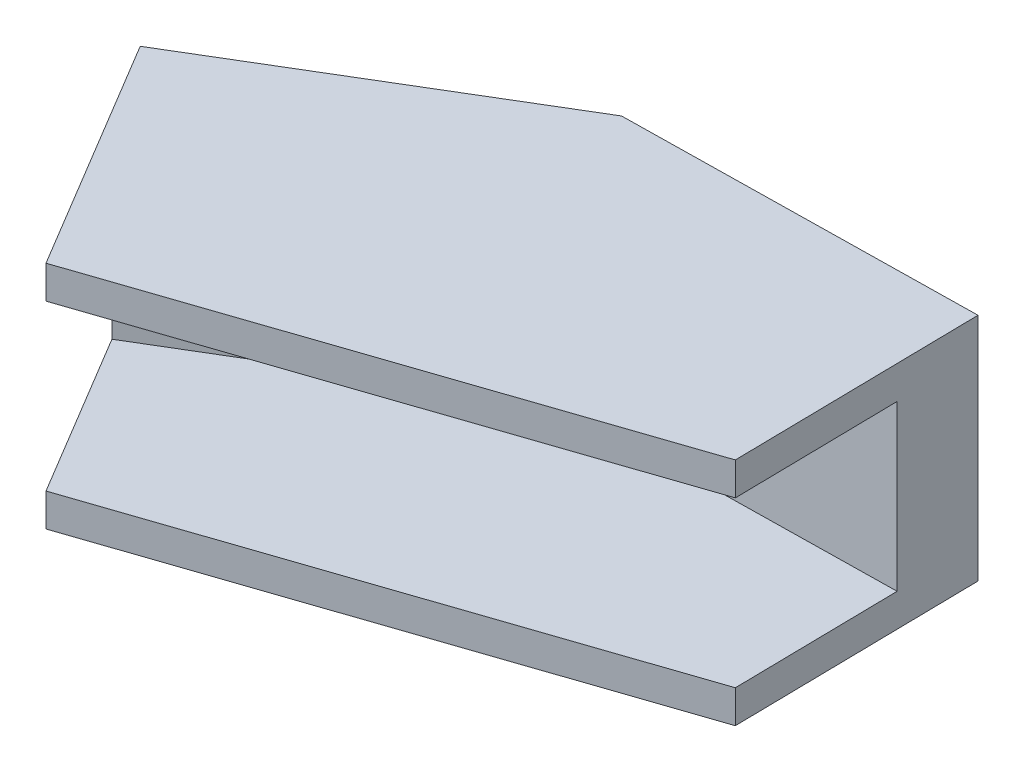
ISO-10303-21;
HEADER;
FILE_DESCRIPTION(('STEP AP214'),'2;1');
FILE_NAME('part.step','',(''),(''),'','','');
FILE_SCHEMA(('AUTOMOTIVE_DESIGN { 1 0 10303 214 1 1 1 1 }'));
ENDSEC;
DATA;
#1=APPLICATION_CONTEXT('core data for automotive mechanical design processes');
#2=APPLICATION_PROTOCOL_DEFINITION('international standard','automotive_design',2000,#1);
#3=PRODUCT_CONTEXT('',#1,'mechanical');
#4=PRODUCT('Part','Part','',(#3));
#5=PRODUCT_RELATED_PRODUCT_CATEGORY('part','',(#4));
#6=PRODUCT_DEFINITION_FORMATION('','',#4);
#7=PRODUCT_DEFINITION_CONTEXT('part definition',#1,'design');
#8=PRODUCT_DEFINITION('design','',#6,#7);
#9=PRODUCT_DEFINITION_SHAPE('','',#8);
#10=(LENGTH_UNIT() NAMED_UNIT(*) SI_UNIT(.MILLI.,.METRE.));
#11=(NAMED_UNIT(*) PLANE_ANGLE_UNIT() SI_UNIT($,.RADIAN.));
#12=(NAMED_UNIT(*) SI_UNIT($,.STERADIAN.) SOLID_ANGLE_UNIT());
#13=UNCERTAINTY_MEASURE_WITH_UNIT(LENGTH_MEASURE(1.E-05),#10,'distance_accuracy_value','');
#14=(GEOMETRIC_REPRESENTATION_CONTEXT(3) GLOBAL_UNCERTAINTY_ASSIGNED_CONTEXT((#13)) GLOBAL_UNIT_ASSIGNED_CONTEXT((#10,
#11,#12)) REPRESENTATION_CONTEXT('',''));
#15=CARTESIAN_POINT('',(0.,0.,0.));
#16=DIRECTION('',(0.,0.,1.));
#17=DIRECTION('',(1.,0.,0.));
#18=AXIS2_PLACEMENT_3D('',#15,#16,#17);
#19=CARTESIAN_POINT('',(19.9973993317551,10.,-0.32252126491264));
#20=DIRECTION('',(0.999869966587755,0.,-0.016126063245632));
#21=DIRECTION('',(-0.016126063245632,0.,-0.999869966587755));
#22=AXIS2_PLACEMENT_3D('',#19,#20,#21);
#23=PLANE('',#22);
#24=DIRECTION('',(0.,-1.,0.));
#25=VECTOR('',#24,1.);
#26=CARTESIAN_POINT('',(19.9973993317551,10.,-0.322521264912666));
#27=LINE('',#26,#25);
#28=CARTESIAN_POINT('',(19.9973993317551,10.,-0.322521264912667));
#29=VERTEX_POINT('',#28);
#30=CARTESIAN_POINT('',(19.9973993317551,0.,-0.322521264912666));
#31=VERTEX_POINT('',#30);
#32=EDGE_CURVE('E63',#29,#31,#27,.T.);
#33=ORIENTED_EDGE('',*,*,#32,.T.);
#34=DIRECTION('',(-0.0161260632456342,0.,-0.999869966587755));
#35=VECTOR('',#34,1.);
#36=CARTESIAN_POINT('',(19.9973993317551,0.,-0.322521264912666));
#37=LINE('',#36,#35);
#38=CARTESIAN_POINT('',(20.1586809362088,0.,9.67747873508733));
#39=VERTEX_POINT('',#38);
#40=EDGE_CURVE('E142',#39,#31,#37,.T.);
#41=ORIENTED_EDGE('',*,*,#40,.F.);
#42=DIRECTION('',(0.,1.,0.));
#43=VECTOR('',#42,1.);
#44=CARTESIAN_POINT('',(20.1586809362088,-2.,9.67747873508733));
#45=LINE('',#44,#43);
#46=CARTESIAN_POINT('',(20.1586809362088,-2.,9.67747873508733));
#47=VERTEX_POINT('',#46);
#48=EDGE_CURVE('E151',#47,#39,#45,.T.);
#49=ORIENTED_EDGE('',*,*,#48,.F.);
#50=DIRECTION('',(-0.016126063245632,0.,-0.999869966587755));
#51=VECTOR('',#50,1.);
#52=CARTESIAN_POINT('',(19.9167690155269,-2.,-5.32187109785144));
#53=LINE('',#52,#51);
#54=CARTESIAN_POINT('',(19.9167690155269,-2.,-5.32187109785144));
#55=VERTEX_POINT('',#54);
#56=EDGE_CURVE('E133',#47,#55,#53,.T.);
#57=ORIENTED_EDGE('',*,*,#56,.T.);
#58=DIRECTION('',(0.,-1.,0.));
#59=VECTOR('',#58,1.);
#60=CARTESIAN_POINT('',(19.9167690155269,10.,-5.32187109785144));
#61=LINE('',#60,#59);
#62=CARTESIAN_POINT('',(19.9167690155269,12.,-5.32187109785144));
#63=VERTEX_POINT('',#62);
#64=EDGE_CURVE('E11',#63,#55,#61,.T.);
#65=ORIENTED_EDGE('',*,*,#64,.F.);
#66=DIRECTION('',(-0.0161260632456342,0.,-0.999869966587755));
#67=VECTOR('',#66,1.);
#68=CARTESIAN_POINT('',(19.9973993317551,12.,-0.322521264912666));
#69=LINE('',#68,#67);
#70=CARTESIAN_POINT('',(20.1586809362088,12.,9.67747873508733));
#71=VERTEX_POINT('',#70);
#72=EDGE_CURVE('E160',#71,#63,#69,.T.);
#73=ORIENTED_EDGE('',*,*,#72,.F.);
#74=DIRECTION('',(0.,-1.,0.));
#75=VECTOR('',#74,1.);
#76=CARTESIAN_POINT('',(20.1586809362088,12.,9.67747873508733));
#77=LINE('',#76,#75);
#78=CARTESIAN_POINT('',(20.1586809362088,10.,9.67747873508733));
#79=VERTEX_POINT('',#78);
#80=EDGE_CURVE('E165',#71,#79,#77,.T.);
#81=ORIENTED_EDGE('',*,*,#80,.T.);
#82=DIRECTION('',(-0.016126063245632,0.,-0.999869966587755));
#83=VECTOR('',#82,1.);
#84=CARTESIAN_POINT('',(19.9167690155269,10.,-5.32187109785144));
#85=LINE('',#84,#83);
#86=EDGE_CURVE('E156',#79,#29,#85,.T.);
#87=ORIENTED_EDGE('',*,*,#86,.T.);
#88=EDGE_LOOP('',(#33,#41,#49,#57,#65,#73,#81,#87));
#89=FACE_BOUND('',#88,.T.);
#90=ADVANCED_FACE('F35',(#89),#23,.T.);
#91=CARTESIAN_POINT('',(-0.0806303162281668,10.,-4.99934983293877));
#92=DIRECTION('',(-0.0161260632456334,0.,-0.999869966587755));
#93=DIRECTION('',(-0.999869966587755,0.,0.0161260632456334));
#94=AXIS2_PLACEMENT_3D('',#91,#92,#93);
#95=PLANE('',#94);
#96=ORIENTED_EDGE('',*,*,#64,.T.);
#97=DIRECTION('',(-0.999869966587755,0.,0.0161260632456334));
#98=VECTOR('',#97,1.);
#99=CARTESIAN_POINT('',(-1.42020206664477,-2.,-4.97774500481997));
#100=LINE('',#99,#98);
#101=CARTESIAN_POINT('',(-1.42020206664477,-2.,-4.97774500481997));
#102=VERTEX_POINT('',#101);
#103=EDGE_CURVE('E125',#55,#102,#100,.T.);
#104=ORIENTED_EDGE('',*,*,#103,.T.);
#105=DIRECTION('',(0.,-1.,0.));
#106=VECTOR('',#105,1.);
#107=CARTESIAN_POINT('',(-1.42020206664477,10.,-4.97774500481997));
#108=LINE('',#107,#106);
#109=CARTESIAN_POINT('',(-1.42020206664477,12.,-4.97774500481997));
#110=VERTEX_POINT('',#109);
#111=EDGE_CURVE('E43',#110,#102,#108,.T.);
#112=ORIENTED_EDGE('',*,*,#111,.F.);
#113=DIRECTION('',(-0.999869966587755,0.,0.0161260632456334));
#114=VECTOR('',#113,1.);
#115=CARTESIAN_POINT('',(-1.42020206664477,12.,-4.97774500481997));
#116=LINE('',#115,#114);
#117=EDGE_CURVE('E163',#63,#110,#116,.T.);
#118=ORIENTED_EDGE('',*,*,#117,.F.);
#119=EDGE_LOOP('',(#96,#104,#112,#118));
#120=FACE_BOUND('',#119,.T.);
#121=ADVANCED_FACE('F132',(#120),#95,.T.);
#122=CARTESIAN_POINT('',(-2.56950281863813,10.,-4.2892487996164));
#123=DIRECTION('',(0.513900563727625,0.,0.85784975992328));
#124=DIRECTION('',(0.85784975992328,0.,-0.513900563727625));
#125=AXIS2_PLACEMENT_3D('',#122,#123,#124);
#126=PLANE('',#125);
#127=ORIENTED_EDGE('',*,*,#111,.T.);
#128=DIRECTION('',(-0.85784975992328,0.,0.513900563727625));
#129=VECTOR('',#128,1.);
#130=CARTESIAN_POINT('',(-19.7264980171037,-2.,5.98876247493611));
#131=LINE('',#130,#129);
#132=CARTESIAN_POINT('',(-19.7264980171037,-2.,5.98876247493611));
#133=VERTEX_POINT('',#132);
#134=EDGE_CURVE('E113',#102,#133,#131,.T.);
#135=ORIENTED_EDGE('',*,*,#134,.T.);
#136=DIRECTION('',(0.,-1.,0.));
#137=VECTOR('',#136,1.);
#138=CARTESIAN_POINT('',(-19.7264980171037,10.,5.98876247493611));
#139=LINE('',#138,#137);
#140=CARTESIAN_POINT('',(-19.7264980171037,12.,5.98876247493611));
#141=VERTEX_POINT('',#140);
#142=EDGE_CURVE('E120',#141,#133,#139,.T.);
#143=ORIENTED_EDGE('',*,*,#142,.F.);
#144=DIRECTION('',(-0.85784975992328,0.,0.513900563727625));
#145=VECTOR('',#144,1.);
#146=CARTESIAN_POINT('',(-19.7264980171037,12.,5.98876247493611));
#147=LINE('',#146,#145);
#148=EDGE_CURVE('E115',#110,#141,#147,.T.);
#149=ORIENTED_EDGE('',*,*,#148,.F.);
#150=EDGE_LOOP('',(#127,#135,#143,#149));
#151=FACE_BOUND('',#150,.T.);
#152=ADVANCED_FACE('F112',(#151),#126,.F.);
#153=CARTESIAN_POINT('',(-17.1569951984656,10.,10.2780112745525));
#154=DIRECTION('',(0.85784975992328,0.,-0.513900563727625));
#155=DIRECTION('',(-0.513900563727625,0.,-0.85784975992328));
#156=AXIS2_PLACEMENT_3D('',#153,#154,#155);
#157=PLANE('',#156);
#158=DIRECTION('',(0.,-1.,0.));
#159=VECTOR('',#158,1.);
#160=CARTESIAN_POINT('',(-17.1569951984656,10.,10.2780112745525));
#161=LINE('',#160,#159);
#162=CARTESIAN_POINT('',(-17.1569951984656,10.,10.2780112745525));
#163=VERTEX_POINT('',#162);
#164=CARTESIAN_POINT('',(-17.1569951984656,0.,10.2780112745525));
#165=VERTEX_POINT('',#164);
#166=EDGE_CURVE('E188',#163,#165,#161,.T.);
#167=ORIENTED_EDGE('',*,*,#166,.F.);
#168=DIRECTION('',(0.513900563727625,0.,0.85784975992328));
#169=VECTOR('',#168,1.);
#170=CARTESIAN_POINT('',(-17.1569951984656,10.,10.2780112745525));
#171=LINE('',#170,#169);
#172=CARTESIAN_POINT('',(-11.1664291607298,10.,20.2780112745525));
#173=VERTEX_POINT('',#172);
#174=EDGE_CURVE('E153',#163,#173,#171,.T.);
#175=ORIENTED_EDGE('',*,*,#174,.T.);
#176=DIRECTION('',(0.,-1.,0.));
#177=VECTOR('',#176,1.);
#178=CARTESIAN_POINT('',(-11.1664291607298,12.,20.2780112745525));
#179=LINE('',#178,#177);
#180=CARTESIAN_POINT('',(-11.1664291607298,12.,20.2780112745525));
#181=VERTEX_POINT('',#180);
#182=EDGE_CURVE('E174',#181,#173,#179,.T.);
#183=ORIENTED_EDGE('',*,*,#182,.F.);
#184=DIRECTION('',(0.513900563727625,0.,0.85784975992328));
#185=VECTOR('',#184,1.);
#186=CARTESIAN_POINT('',(-19.7264980171037,12.,5.98876247493611));
#187=LINE('',#186,#185);
#188=EDGE_CURVE('E155',#141,#181,#187,.T.);
#189=ORIENTED_EDGE('',*,*,#188,.F.);
#190=ORIENTED_EDGE('',*,*,#142,.T.);
#191=DIRECTION('',(0.513900563727625,0.,0.85784975992328));
#192=VECTOR('',#191,1.);
#193=CARTESIAN_POINT('',(-17.1569951984656,-2.,10.2780112745525));
#194=LINE('',#193,#192);
#195=CARTESIAN_POINT('',(-11.1664291607298,-2.,20.2780112745525));
#196=VERTEX_POINT('',#195);
#197=EDGE_CURVE('E129',#133,#196,#194,.T.);
#198=ORIENTED_EDGE('',*,*,#197,.T.);
#199=DIRECTION('',(0.,1.,0.));
#200=VECTOR('',#199,1.);
#201=CARTESIAN_POINT('',(-11.1664291607298,-2.,20.2780112745525));
#202=LINE('',#201,#200);
#203=CARTESIAN_POINT('',(-11.1664291607298,0.,20.2780112745525));
#204=VERTEX_POINT('',#203);
#205=EDGE_CURVE('E141',#196,#204,#202,.T.);
#206=ORIENTED_EDGE('',*,*,#205,.T.);
#207=DIRECTION('',(0.513900563727625,0.,0.85784975992328));
#208=VECTOR('',#207,1.);
#209=CARTESIAN_POINT('',(-19.7264980171037,0.,5.98876247493611));
#210=LINE('',#209,#208);
#211=EDGE_CURVE('E130',#165,#204,#210,.T.);
#212=ORIENTED_EDGE('',*,*,#211,.F.);
#213=EDGE_LOOP('',(#167,#175,#183,#189,#190,#198,#206,#212));
#214=FACE_BOUND('',#213,.T.);
#215=ADVANCED_FACE('F192',(#214),#157,.F.);
#216=CARTESIAN_POINT('',(0.,10.,0.));
#217=DIRECTION('',(0.513900563727625,0.,0.85784975992328));
#218=DIRECTION('',(0.85784975992328,0.,-0.513900563727625));
#219=AXIS2_PLACEMENT_3D('',#216,#217,#218);
#220=PLANE('',#219);
#221=DIRECTION('',(-0.85784975992328,0.,0.513900563727625));
#222=VECTOR('',#221,1.);
#223=CARTESIAN_POINT('',(0.,0.,0.));
#224=LINE('',#223,#222);
#225=CARTESIAN_POINT('',(0.,0.,0.));
#226=VERTEX_POINT('',#225);
#227=EDGE_CURVE('E177',#226,#165,#224,.T.);
#228=ORIENTED_EDGE('',*,*,#227,.F.);
#229=DIRECTION('',(0.,-1.,0.));
#230=VECTOR('',#229,1.);
#231=CARTESIAN_POINT('',(0.,10.,0.));
#232=LINE('',#231,#230);
#233=CARTESIAN_POINT('',(0.,10.,0.));
#234=VERTEX_POINT('',#233);
#235=EDGE_CURVE('E51',#234,#226,#232,.T.);
#236=ORIENTED_EDGE('',*,*,#235,.F.);
#237=DIRECTION('',(-0.85784975992328,0.,0.513900563727625));
#238=VECTOR('',#237,1.);
#239=CARTESIAN_POINT('',(0.,10.,0.));
#240=LINE('',#239,#238);
#241=EDGE_CURVE('E178',#234,#163,#240,.T.);
#242=ORIENTED_EDGE('',*,*,#241,.T.);
#243=ORIENTED_EDGE('',*,*,#166,.T.);
#244=EDGE_LOOP('',(#228,#236,#242,#243));
#245=FACE_BOUND('',#244,.T.);
#246=ADVANCED_FACE('F209',(#245),#220,.T.);
#247=CARTESIAN_POINT('',(0.,10.,0.));
#248=DIRECTION('',(-0.0161260632456333,0.,-0.999869966587755));
#249=DIRECTION('',(-0.999869966587755,0.,0.0161260632456333));
#250=AXIS2_PLACEMENT_3D('',#247,#248,#249);
#251=PLANE('',#250);
#252=DIRECTION('',(0.999869966587755,0.,-0.0161260632456333));
#253=VECTOR('',#252,1.);
#254=CARTESIAN_POINT('',(0.,0.,0.));
#255=LINE('',#254,#253);
#256=EDGE_CURVE('E181',#226,#31,#255,.T.);
#257=ORIENTED_EDGE('',*,*,#256,.T.);
#258=ORIENTED_EDGE('',*,*,#32,.F.);
#259=DIRECTION('',(0.999869966587755,0.,-0.0161260632456333));
#260=VECTOR('',#259,1.);
#261=CARTESIAN_POINT('',(0.,10.,0.));
#262=LINE('',#261,#260);
#263=EDGE_CURVE('E180',#234,#29,#262,.T.);
#264=ORIENTED_EDGE('',*,*,#263,.F.);
#265=ORIENTED_EDGE('',*,*,#235,.T.);
#266=EDGE_LOOP('',(#257,#258,#264,#265));
#267=FACE_BOUND('',#266,.T.);
#268=ADVANCED_FACE('F224',(#267),#251,.F.);
#269=CARTESIAN_POINT('',(0.,10.,0.));
#270=DIRECTION('',(0.,-1.,0.));
#271=DIRECTION('',(0.,0.,-1.));
#272=AXIS2_PLACEMENT_3D('',#269,#270,#271);
#273=PLANE('',#272);
#274=ORIENTED_EDGE('',*,*,#241,.F.);
#275=ORIENTED_EDGE('',*,*,#263,.T.);
#276=ORIENTED_EDGE('',*,*,#86,.F.);
#277=DIRECTION('',(0.947232611210359,0.,-0.320547001638769));
#278=VECTOR('',#277,1.);
#279=CARTESIAN_POINT('',(-11.1664291607298,10.,20.2780112745525));
#280=LINE('',#279,#278);
#281=EDGE_CURVE('E167',#173,#79,#280,.T.);
#282=ORIENTED_EDGE('',*,*,#281,.F.);
#283=ORIENTED_EDGE('',*,*,#174,.F.);
#284=EDGE_LOOP('',(#274,#275,#276,#282,#283));
#285=FACE_BOUND('',#284,.T.);
#286=ADVANCED_FACE('F214',(#285),#273,.T.);
#287=CARTESIAN_POINT('',(-11.1664291607298,12.,20.2780112745525));
#288=DIRECTION('',(-0.320547001638769,0.,-0.947232611210359));
#289=DIRECTION('',(-0.947232611210359,0.,0.320547001638769));
#290=AXIS2_PLACEMENT_3D('',#287,#288,#289);
#291=PLANE('',#290);
#292=ORIENTED_EDGE('',*,*,#281,.T.);
#293=ORIENTED_EDGE('',*,*,#80,.F.);
#294=DIRECTION('',(0.947232611210359,0.,-0.320547001638769));
#295=VECTOR('',#294,1.);
#296=CARTESIAN_POINT('',(-11.1664291607298,12.,20.2780112745525));
#297=LINE('',#296,#295);
#298=EDGE_CURVE('E158',#181,#71,#297,.T.);
#299=ORIENTED_EDGE('',*,*,#298,.F.);
#300=ORIENTED_EDGE('',*,*,#182,.T.);
#301=EDGE_LOOP('',(#292,#293,#299,#300));
#302=FACE_BOUND('',#301,.T.);
#303=ADVANCED_FACE('F216',(#302),#291,.F.);
#304=CARTESIAN_POINT('',(0.,12.,0.));
#305=DIRECTION('',(0.,-1.,0.));
#306=DIRECTION('',(0.,0.,-1.));
#307=AXIS2_PLACEMENT_3D('',#304,#305,#306);
#308=PLANE('',#307);
#309=ORIENTED_EDGE('',*,*,#148,.T.);
#310=ORIENTED_EDGE('',*,*,#188,.T.);
#311=ORIENTED_EDGE('',*,*,#298,.T.);
#312=ORIENTED_EDGE('',*,*,#72,.T.);
#313=ORIENTED_EDGE('',*,*,#117,.T.);
#314=EDGE_LOOP('',(#309,#310,#311,#312,#313));
#315=FACE_BOUND('',#314,.T.);
#316=ADVANCED_FACE('F196',(#315),#308,.F.);
#317=CARTESIAN_POINT('',(0.,0.,0.));
#318=DIRECTION('',(0.,1.,0.));
#319=DIRECTION('',(0.,0.,-1.));
#320=AXIS2_PLACEMENT_3D('',#317,#318,#319);
#321=PLANE('',#320);
#322=ORIENTED_EDGE('',*,*,#256,.F.);
#323=ORIENTED_EDGE('',*,*,#227,.T.);
#324=ORIENTED_EDGE('',*,*,#211,.T.);
#325=DIRECTION('',(0.947232611210359,0.,-0.320547001638769));
#326=VECTOR('',#325,1.);
#327=CARTESIAN_POINT('',(-11.1664291607298,0.,20.2780112745525));
#328=LINE('',#327,#326);
#329=EDGE_CURVE('E145',#204,#39,#328,.T.);
#330=ORIENTED_EDGE('',*,*,#329,.T.);
#331=ORIENTED_EDGE('',*,*,#40,.T.);
#332=EDGE_LOOP('',(#322,#323,#324,#330,#331));
#333=FACE_BOUND('',#332,.T.);
#334=ADVANCED_FACE('F208',(#333),#321,.T.);
#335=CARTESIAN_POINT('',(-11.1664291607298,-2.,20.2780112745525));
#336=DIRECTION('',(0.320547001638769,0.,0.947232611210359));
#337=DIRECTION('',(0.947232611210359,0.,-0.320547001638769));
#338=AXIS2_PLACEMENT_3D('',#335,#336,#337);
#339=PLANE('',#338);
#340=ORIENTED_EDGE('',*,*,#329,.F.);
#341=ORIENTED_EDGE('',*,*,#205,.F.);
#342=DIRECTION('',(0.947232611210359,0.,-0.320547001638769));
#343=VECTOR('',#342,1.);
#344=CARTESIAN_POINT('',(-11.1664291607298,-2.,20.2780112745525));
#345=LINE('',#344,#343);
#346=EDGE_CURVE('E135',#196,#47,#345,.T.);
#347=ORIENTED_EDGE('',*,*,#346,.T.);
#348=ORIENTED_EDGE('',*,*,#48,.T.);
#349=EDGE_LOOP('',(#340,#341,#347,#348));
#350=FACE_BOUND('',#349,.T.);
#351=ADVANCED_FACE('F204',(#350),#339,.T.);
#352=CARTESIAN_POINT('',(0.,-2.,0.));
#353=DIRECTION('',(0.,1.,0.));
#354=DIRECTION('',(0.,0.,-1.));
#355=AXIS2_PLACEMENT_3D('',#352,#353,#354);
#356=PLANE('',#355);
#357=ORIENTED_EDGE('',*,*,#134,.F.);
#358=ORIENTED_EDGE('',*,*,#103,.F.);
#359=ORIENTED_EDGE('',*,*,#56,.F.);
#360=ORIENTED_EDGE('',*,*,#346,.F.);
#361=ORIENTED_EDGE('',*,*,#197,.F.);
#362=EDGE_LOOP('',(#357,#358,#359,#360,#361));
#363=FACE_BOUND('',#362,.T.);
#364=ADVANCED_FACE('F124',(#363),#356,.F.);
#365=CLOSED_SHELL('',(#90,#121,#152,#215,#246,#268,#286,#303,#316,#334,#351,#364));
#366=MANIFOLD_SOLID_BREP('B2',#365);
#367=ADVANCED_BREP_SHAPE_REPRESENTATION('',(#18,#366),#14);
#368=SHAPE_DEFINITION_REPRESENTATION(#9,#367);
ENDSEC;
END-ISO-10303-21;
